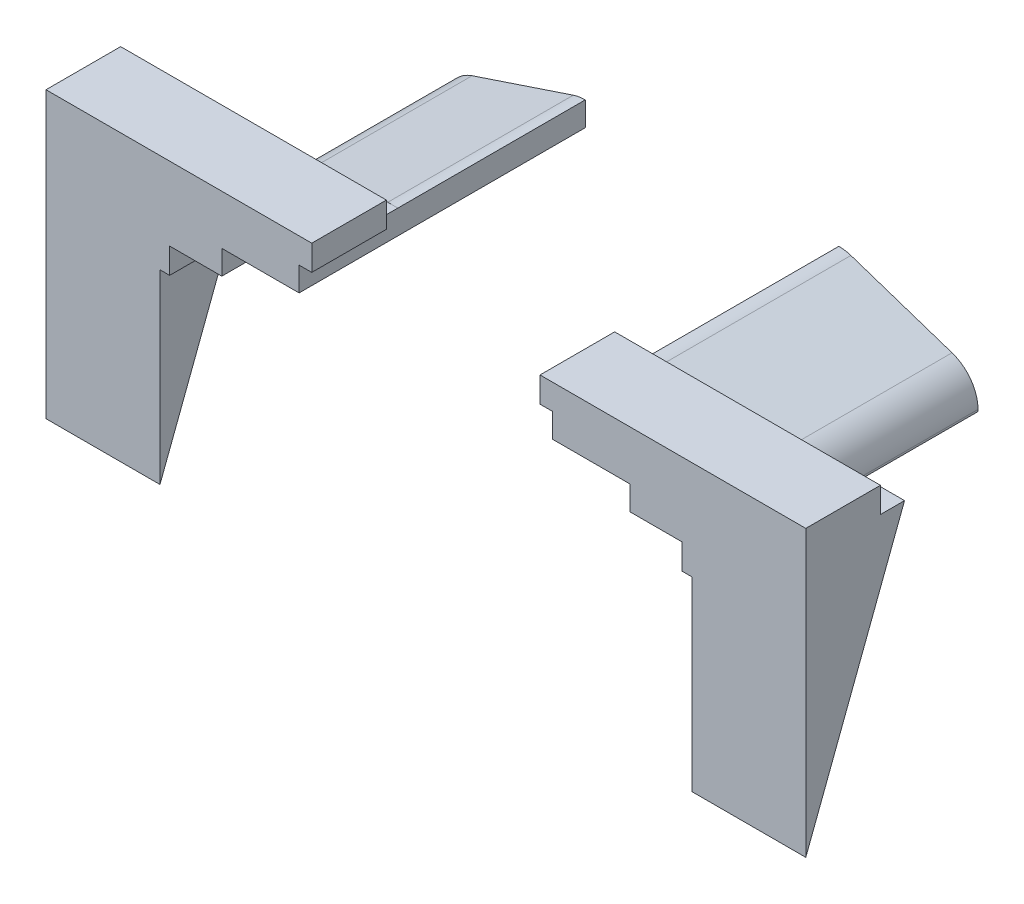
ISO-10303-21;
HEADER;
FILE_DESCRIPTION(('STEP AP214'),'2;1');
FILE_NAME('part.step','',(''),(''),'','','');
FILE_SCHEMA(('AUTOMOTIVE_DESIGN { 1 0 10303 214 1 1 1 1 }'));
ENDSEC;
DATA;
#1=APPLICATION_CONTEXT('core data for automotive mechanical design processes');
#2=APPLICATION_PROTOCOL_DEFINITION('international standard','automotive_design',2000,#1);
#3=PRODUCT_CONTEXT('',#1,'mechanical');
#4=PRODUCT('Part','Part','',(#3));
#5=PRODUCT_RELATED_PRODUCT_CATEGORY('part','',(#4));
#6=PRODUCT_DEFINITION_FORMATION('','',#4);
#7=PRODUCT_DEFINITION_CONTEXT('part definition',#1,'design');
#8=PRODUCT_DEFINITION('design','',#6,#7);
#9=PRODUCT_DEFINITION_SHAPE('','',#8);
#10=(LENGTH_UNIT() NAMED_UNIT(*) SI_UNIT(.MILLI.,.METRE.));
#11=(NAMED_UNIT(*) PLANE_ANGLE_UNIT() SI_UNIT($,.RADIAN.));
#12=(NAMED_UNIT(*) SI_UNIT($,.STERADIAN.) SOLID_ANGLE_UNIT());
#13=UNCERTAINTY_MEASURE_WITH_UNIT(LENGTH_MEASURE(1.E-05),#10,'distance_accuracy_value','');
#14=(GEOMETRIC_REPRESENTATION_CONTEXT(3) GLOBAL_UNCERTAINTY_ASSIGNED_CONTEXT((#13)) GLOBAL_UNIT_ASSIGNED_CONTEXT((#10,
#11,#12)) REPRESENTATION_CONTEXT('',''));
#15=CARTESIAN_POINT('',(0.,0.,0.));
#16=DIRECTION('',(0.,0.,1.));
#17=DIRECTION('',(1.,0.,0.));
#18=AXIS2_PLACEMENT_3D('',#15,#16,#17);
#19=CARTESIAN_POINT('',(-300.,5.0000000000001,167.05));
#20=DIRECTION('',(0.,1.,0.));
#21=DIRECTION('',(0.,0.,1.));
#22=AXIS2_PLACEMENT_3D('',#19,#20,#21);
#23=PLANE('',#22);
#24=DIRECTION('',(0.,0.,1.));
#25=VECTOR('',#24,1.);
#26=CARTESIAN_POINT('',(-100.131670194949,4.99999999999998,-345.933108931715));
#27=LINE('',#26,#25);
#28=CARTESIAN_POINT('',(-100.131670194949,5.00000000000007,148.));
#29=VERTEX_POINT('',#28);
#30=CARTESIAN_POINT('',(-100.131670194949,4.99999999999998,167.05));
#31=VERTEX_POINT('',#30);
#32=EDGE_CURVE('E194',#29,#31,#27,.T.);
#33=ORIENTED_EDGE('',*,*,#32,.F.);
#34=DIRECTION('',(1.,0.,0.));
#35=VECTOR('',#34,1.);
#36=CARTESIAN_POINT('',(-300.,5.0000000000001,148.));
#37=LINE('',#36,#35);
#38=CARTESIAN_POINT('',(-300.,5.0000000000001,148.));
#39=VERTEX_POINT('',#38);
#40=EDGE_CURVE('E219',#39,#29,#37,.T.);
#41=ORIENTED_EDGE('',*,*,#40,.F.);
#42=DIRECTION('',(0.,0.,-1.));
#43=VECTOR('',#42,1.);
#44=CARTESIAN_POINT('',(-300.,5.0000000000001,167.05));
#45=LINE('',#44,#43);
#46=CARTESIAN_POINT('',(-300.,5.0000000000001,167.05));
#47=VERTEX_POINT('',#46);
#48=EDGE_CURVE('E195',#47,#39,#45,.T.);
#49=ORIENTED_EDGE('',*,*,#48,.F.);
#50=DIRECTION('',(-1.,0.,0.));
#51=VECTOR('',#50,1.);
#52=CARTESIAN_POINT('',(-300.,5.0000000000001,167.05));
#53=LINE('',#52,#51);
#54=EDGE_CURVE('E204',#31,#47,#53,.T.);
#55=ORIENTED_EDGE('',*,*,#54,.F.);
#56=EDGE_LOOP('',(#33,#41,#49,#55));
#57=FACE_BOUND('',#56,.T.);
#58=ADVANCED_FACE('F46',(#57),#23,.T.);
#59=CARTESIAN_POINT('',(0.,0.,167.05));
#60=DIRECTION('',(0.,0.,1.));
#61=DIRECTION('',(-1.,0.,0.));
#62=AXIS2_PLACEMENT_3D('',#59,#60,#61);
#63=PLANE('',#62);
#64=DIRECTION('',(-1.,0.,0.));
#65=VECTOR('',#64,1.);
#66=CARTESIAN_POINT('',(0.,25.0000000000001,167.05));
#67=LINE('',#66,#65);
#68=CARTESIAN_POINT('',(-90.1316701949486,25.0000000000001,167.05));
#69=VERTEX_POINT('',#68);
#70=CARTESIAN_POINT('',(-300.,25.0000000000001,167.05));
#71=VERTEX_POINT('',#70);
#72=EDGE_CURVE('E198',#69,#71,#67,.T.);
#73=ORIENTED_EDGE('',*,*,#72,.F.);
#74=DIRECTION('',(0.,-1.,0.));
#75=VECTOR('',#74,1.);
#76=CARTESIAN_POINT('',(-90.1316701949486,0.,167.05));
#77=LINE('',#76,#75);
#78=CARTESIAN_POINT('',(-90.1316701949486,4.99999999999998,167.05));
#79=VERTEX_POINT('',#78);
#80=EDGE_CURVE('E173',#69,#79,#77,.T.);
#81=ORIENTED_EDGE('',*,*,#80,.T.);
#82=EDGE_CURVE('E201',#79,#31,#53,.T.);
#83=ORIENTED_EDGE('',*,*,#82,.T.);
#84=ORIENTED_EDGE('',*,*,#54,.T.);
#85=DIRECTION('',(0.,1.,0.));
#86=VECTOR('',#85,1.);
#87=CARTESIAN_POINT('',(-300.,5.0000000000001,167.05));
#88=LINE('',#87,#86);
#89=EDGE_CURVE('E199',#47,#71,#88,.T.);
#90=ORIENTED_EDGE('',*,*,#89,.T.);
#91=EDGE_LOOP('',(#73,#81,#83,#84,#90));
#92=FACE_BOUND('',#91,.T.);
#93=ADVANCED_FACE('F307',(#92),#63,.F.);
#94=CARTESIAN_POINT('',(-300.,-200.,226.));
#95=DIRECTION('',(0.,-0.35561611887515,-0.934632107300073));
#96=DIRECTION('',(0.,0.934632107300073,-0.35561611887515));
#97=AXIS2_PLACEMENT_3D('',#94,#95,#96);
#98=PLANE('',#97);
#99=DIRECTION('',(0.94188988136698,0.313963293788993,-0.119459204466056));
#100=VECTOR('',#99,1.);
#101=CARTESIAN_POINT('',(-88.3474224434364,10.5508591855212,145.887965773314));
#102=LINE('',#101,#100);
#103=CARTESIAN_POINT('',(-189.486832980505,-23.1622776601684,158.715403207284));
#104=VERTEX_POINT('',#103);
#105=CARTESIAN_POINT('',(-109.618503175454,3.4604989415154,148.58576137835));
#106=VERTEX_POINT('',#105);
#107=EDGE_CURVE('E242',#104,#106,#102,.T.);
#108=ORIENTED_EDGE('',*,*,#107,.F.);
#109=CARTESIAN_POINT('',(-180.,-51.6227766016838,169.544275975275));
#110=DIRECTION('',(0.,0.35561611887515,0.934632107300073));
#111=DIRECTION('',(0.,-0.934632107300073,0.35561611887515));
#112=AXIS2_PLACEMENT_3D('',#109,#110,#111);
#113=ELLIPSE('',#112,32.0981911125039,30.);
#114=CARTESIAN_POINT('',(-210.,-51.6227766016838,169.544275975275));
#115=VERTEX_POINT('',#114);
#116=EDGE_CURVE('E228',#104,#115,#113,.T.);
#117=ORIENTED_EDGE('',*,*,#116,.T.);
#118=DIRECTION('',(0.,-0.934632107300073,0.35561611887515));
#119=VECTOR('',#118,1.);
#120=CARTESIAN_POINT('',(-210.,49.823110020994,130.945353260305));
#121=LINE('',#120,#119);
#122=CARTESIAN_POINT('',(-210.,-53.131468061771,170.118314677162));
#123=VERTEX_POINT('',#122);
#124=EDGE_CURVE('E215',#115,#123,#121,.T.);
#125=ORIENTED_EDGE('',*,*,#124,.T.);
#126=CARTESIAN_POINT('',(-210.,-200.,226.));
#127=VERTEX_POINT('',#126);
#128=EDGE_CURVE('E187',#123,#127,#121,.T.);
#129=ORIENTED_EDGE('',*,*,#128,.T.);
#130=DIRECTION('',(1.,0.,0.));
#131=VECTOR('',#130,1.);
#132=CARTESIAN_POINT('',(-300.,-200.,226.));
#133=LINE('',#132,#131);
#134=CARTESIAN_POINT('',(-300.,-200.,226.));
#135=VERTEX_POINT('',#134);
#136=EDGE_CURVE('E248',#135,#127,#133,.T.);
#137=ORIENTED_EDGE('',*,*,#136,.F.);
#138=DIRECTION('',(0.,-0.934632107300073,0.35561611887515));
#139=VECTOR('',#138,1.);
#140=CARTESIAN_POINT('',(-300.,-200.,226.));
#141=LINE('',#140,#139);
#142=EDGE_CURVE('E50',#39,#135,#141,.T.);
#143=ORIENTED_EDGE('',*,*,#142,.F.);
#144=ORIENTED_EDGE('',*,*,#40,.T.);
#145=CARTESIAN_POINT('',(-100.131670194949,-25.,159.414634146341));
#146=DIRECTION('',(0.,0.35561611887515,0.934632107300073));
#147=DIRECTION('',(0.,0.934632107300073,-0.35561611887515));
#148=AXIS2_PLACEMENT_3D('',#145,#146,#147);
#149=ELLIPSE('',#148,32.0981911125039,30.);
#150=EDGE_CURVE('E223',#29,#106,#149,.T.);
#151=ORIENTED_EDGE('',*,*,#150,.T.);
#152=EDGE_LOOP('',(#108,#117,#125,#129,#137,#143,#144,#151));
#153=FACE_BOUND('',#152,.T.);
#154=ADVANCED_FACE('F266',(#153),#98,.T.);
#155=CARTESIAN_POINT('',(-105.,4.99999999999998,0.));
#156=DIRECTION('',(-0.316227766016838,0.948683298050514,0.));
#157=DIRECTION('',(0.948683298050514,0.316227766016838,0.));
#158=AXIS2_PLACEMENT_3D('',#155,#156,#157);
#159=PLANE('',#158);
#160=DIRECTION('',(0.948683298050514,0.316227766016838,0.));
#161=VECTOR('',#160,1.);
#162=CARTESIAN_POINT('',(-105.,4.99999999999998,0.));
#163=LINE('',#162,#161);
#164=CARTESIAN_POINT('',(-189.486832980505,-23.1622776601684,0.));
#165=VERTEX_POINT('',#164);
#166=CARTESIAN_POINT('',(-109.618503175454,3.46049894151539,0.));
#167=VERTEX_POINT('',#166);
#168=EDGE_CURVE('E218',#165,#167,#163,.T.);
#169=ORIENTED_EDGE('',*,*,#168,.F.);
#170=DIRECTION('',(0.,0.,1.));
#171=VECTOR('',#170,1.);
#172=CARTESIAN_POINT('',(-189.486832980505,-23.1622776601684,0.));
#173=LINE('',#172,#171);
#174=EDGE_CURVE('E236',#165,#104,#173,.T.);
#175=ORIENTED_EDGE('',*,*,#174,.T.);
#176=ORIENTED_EDGE('',*,*,#107,.T.);
#177=DIRECTION('',(0.,0.,1.));
#178=VECTOR('',#177,1.);
#179=CARTESIAN_POINT('',(-109.618503175454,3.46049894151539,0.));
#180=LINE('',#179,#178);
#181=EDGE_CURVE('E239',#106,#167,#180,.F.);
#182=ORIENTED_EDGE('',*,*,#181,.T.);
#183=EDGE_LOOP('',(#169,#175,#176,#182));
#184=FACE_BOUND('',#183,.T.);
#185=ADVANCED_FACE('F336',(#184),#159,.T.);
#186=CARTESIAN_POINT('',(-180.,-51.6227766016838,0.));
#187=DIRECTION('',(0.,0.,1.));
#188=DIRECTION('',(-1.,0.,0.));
#189=AXIS2_PLACEMENT_3D('',#186,#187,#188);
#190=CYLINDRICAL_SURFACE('',#189,30.);
#191=CARTESIAN_POINT('',(-180.,-51.6227766016838,0.));
#192=DIRECTION('',(0.,0.,-1.));
#193=DIRECTION('',(-1.,0.,0.));
#194=AXIS2_PLACEMENT_3D('',#191,#192,#193);
#195=CIRCLE('',#194,30.);
#196=CARTESIAN_POINT('',(-210.,-51.6227766016838,0.));
#197=VERTEX_POINT('',#196);
#198=EDGE_CURVE('E226',#197,#165,#195,.T.);
#199=ORIENTED_EDGE('',*,*,#198,.F.);
#200=DIRECTION('',(0.,0.,1.));
#201=VECTOR('',#200,1.);
#202=CARTESIAN_POINT('',(-210.,-51.6227766016838,0.));
#203=LINE('',#202,#201);
#204=EDGE_CURVE('E234',#115,#197,#203,.F.);
#205=ORIENTED_EDGE('',*,*,#204,.F.);
#206=ORIENTED_EDGE('',*,*,#116,.F.);
#207=ORIENTED_EDGE('',*,*,#174,.F.);
#208=EDGE_LOOP('',(#199,#205,#206,#207));
#209=FACE_BOUND('',#208,.T.);
#210=ADVANCED_FACE('F357',(#209),#190,.T.);
#211=CARTESIAN_POINT('',(-210.,0.,0.));
#212=DIRECTION('',(1.,0.,0.));
#213=DIRECTION('',(0.,-1.,0.));
#214=AXIS2_PLACEMENT_3D('',#211,#212,#213);
#215=PLANE('',#214);
#216=DIRECTION('',(0.,-1.,0.));
#217=VECTOR('',#216,1.);
#218=CARTESIAN_POINT('',(-210.,0.,0.));
#219=LINE('',#218,#217);
#220=CARTESIAN_POINT('',(-210.,-53.1314680617709,0.));
#221=VERTEX_POINT('',#220);
#222=EDGE_CURVE('E84',#197,#221,#219,.T.);
#223=ORIENTED_EDGE('',*,*,#222,.T.);
#224=DIRECTION('',(0.,0.,1.));
#225=VECTOR('',#224,1.);
#226=CARTESIAN_POINT('',(-210.,-53.1314680617709,-345.933108931715));
#227=LINE('',#226,#225);
#228=EDGE_CURVE('E188',#221,#123,#227,.T.);
#229=ORIENTED_EDGE('',*,*,#228,.T.);
#230=ORIENTED_EDGE('',*,*,#124,.F.);
#231=ORIENTED_EDGE('',*,*,#204,.T.);
#232=EDGE_LOOP('',(#223,#229,#230,#231));
#233=FACE_BOUND('',#232,.T.);
#234=ADVANCED_FACE('F48',(#233),#215,.F.);
#235=CARTESIAN_POINT('',(-100.131670194949,-25.,0.));
#236=DIRECTION('',(0.,0.,-1.));
#237=DIRECTION('',(1.,0.,0.));
#238=AXIS2_PLACEMENT_3D('',#235,#236,#237);
#239=CYLINDRICAL_SURFACE('',#238,30.);
#240=CARTESIAN_POINT('',(-100.131670194949,-25.,0.));
#241=DIRECTION('',(0.,0.,-1.));
#242=DIRECTION('',(-1.,0.,0.));
#243=AXIS2_PLACEMENT_3D('',#240,#241,#242);
#244=CIRCLE('',#243,30.);
#245=CARTESIAN_POINT('',(-100.131670194949,4.99999999999998,0.));
#246=VERTEX_POINT('',#245);
#247=EDGE_CURVE('E220',#167,#246,#244,.T.);
#248=ORIENTED_EDGE('',*,*,#247,.F.);
#249=ORIENTED_EDGE('',*,*,#181,.F.);
#250=ORIENTED_EDGE('',*,*,#150,.F.);
#251=DIRECTION('',(0.,0.,1.));
#252=VECTOR('',#251,1.);
#253=CARTESIAN_POINT('',(-100.131670194949,4.99999999999998,148.));
#254=LINE('',#253,#252);
#255=EDGE_CURVE('E231',#246,#29,#254,.T.);
#256=ORIENTED_EDGE('',*,*,#255,.F.);
#257=EDGE_LOOP('',(#248,#249,#250,#256));
#258=FACE_BOUND('',#257,.T.);
#259=ADVANCED_FACE('F330',(#258),#239,.T.);
#260=CARTESIAN_POINT('',(0.,4.99999999999998,-345.933108931715));
#261=DIRECTION('',(0.,1.,0.));
#262=DIRECTION('',(0.,0.,-1.));
#263=AXIS2_PLACEMENT_3D('',#260,#261,#262);
#264=PLANE('',#263);
#265=DIRECTION('',(0.,0.,1.));
#266=VECTOR('',#265,1.);
#267=CARTESIAN_POINT('',(-90.1316701949486,4.99999999999998,-345.933108931715));
#268=LINE('',#267,#266);
#269=CARTESIAN_POINT('',(-90.1316701949486,4.99999999999998,226.));
#270=VERTEX_POINT('',#269);
#271=EDGE_CURVE('E192',#79,#270,#268,.T.);
#272=ORIENTED_EDGE('',*,*,#271,.T.);
#273=DIRECTION('',(1.,0.,0.));
#274=VECTOR('',#273,1.);
#275=CARTESIAN_POINT('',(0.,4.99999999999998,226.));
#276=LINE('',#275,#274);
#277=CARTESIAN_POINT('',(-100.131670194949,4.99999999999998,226.));
#278=VERTEX_POINT('',#277);
#279=EDGE_CURVE('E285',#278,#270,#276,.T.);
#280=ORIENTED_EDGE('',*,*,#279,.F.);
#281=EDGE_CURVE('E189',#31,#278,#27,.T.);
#282=ORIENTED_EDGE('',*,*,#281,.F.);
#283=ORIENTED_EDGE('',*,*,#82,.F.);
#284=EDGE_LOOP('',(#272,#280,#282,#283));
#285=FACE_BOUND('',#284,.T.);
#286=ADVANCED_FACE('F299',(#285),#264,.F.);
#287=CARTESIAN_POINT('',(-90.1316701949486,0.,-345.933108931715));
#288=DIRECTION('',(-1.,0.,0.));
#289=DIRECTION('',(0.,0.,-1.));
#290=AXIS2_PLACEMENT_3D('',#287,#288,#289);
#291=PLANE('',#290);
#292=DIRECTION('',(0.,0.,1.));
#293=VECTOR('',#292,1.);
#294=CARTESIAN_POINT('',(-90.1316701949486,25.0000000000001,-345.933108931715));
#295=LINE('',#294,#293);
#296=CARTESIAN_POINT('',(-90.1316701949486,25.0000000000001,226.));
#297=VERTEX_POINT('',#296);
#298=EDGE_CURVE('E210',#69,#297,#295,.T.);
#299=ORIENTED_EDGE('',*,*,#298,.T.);
#300=DIRECTION('',(0.,1.,0.));
#301=VECTOR('',#300,1.);
#302=CARTESIAN_POINT('',(-90.1316701949486,0.,226.));
#303=LINE('',#302,#301);
#304=EDGE_CURVE('E282',#270,#297,#303,.T.);
#305=ORIENTED_EDGE('',*,*,#304,.F.);
#306=ORIENTED_EDGE('',*,*,#271,.F.);
#307=ORIENTED_EDGE('',*,*,#80,.F.);
#308=EDGE_LOOP('',(#299,#305,#306,#307));
#309=FACE_BOUND('',#308,.T.);
#310=ADVANCED_FACE('F302',(#309),#291,.F.);
#311=CARTESIAN_POINT('',(-100.131670194949,0.,-345.933108931715));
#312=DIRECTION('',(-1.,0.,0.));
#313=DIRECTION('',(0.,0.,-1.));
#314=AXIS2_PLACEMENT_3D('',#311,#312,#313);
#315=PLANE('',#314);
#316=ORIENTED_EDGE('',*,*,#255,.T.);
#317=ORIENTED_EDGE('',*,*,#32,.T.);
#318=ORIENTED_EDGE('',*,*,#281,.T.);
#319=DIRECTION('',(0.,1.,0.));
#320=VECTOR('',#319,1.);
#321=CARTESIAN_POINT('',(-100.131670194949,0.,226.));
#322=LINE('',#321,#320);
#323=CARTESIAN_POINT('',(-100.131670194949,-14.05,226.));
#324=VERTEX_POINT('',#323);
#325=EDGE_CURVE('E165',#324,#278,#322,.T.);
#326=ORIENTED_EDGE('',*,*,#325,.F.);
#327=DIRECTION('',(0.,0.,1.));
#328=VECTOR('',#327,1.);
#329=CARTESIAN_POINT('',(-100.131670194949,-14.05,-345.933108931715));
#330=LINE('',#329,#328);
#331=CARTESIAN_POINT('',(-100.131670194949,-14.05,0.));
#332=VERTEX_POINT('',#331);
#333=EDGE_CURVE('E193',#332,#324,#330,.T.);
#334=ORIENTED_EDGE('',*,*,#333,.F.);
#335=DIRECTION('',(0.,-1.,0.));
#336=VECTOR('',#335,1.);
#337=CARTESIAN_POINT('',(-100.131670194949,0.,0.));
#338=LINE('',#337,#336);
#339=EDGE_CURVE('E182',#246,#332,#338,.T.);
#340=ORIENTED_EDGE('',*,*,#339,.F.);
#341=EDGE_LOOP('',(#316,#317,#318,#326,#334,#340));
#342=FACE_BOUND('',#341,.T.);
#343=ADVANCED_FACE('F294',(#342),#315,.F.);
#344=CARTESIAN_POINT('',(0.,-14.05,-345.933108931715));
#345=DIRECTION('',(0.,1.,0.));
#346=DIRECTION('',(-1.,0.,0.));
#347=AXIS2_PLACEMENT_3D('',#344,#345,#346);
#348=PLANE('',#347);
#349=ORIENTED_EDGE('',*,*,#333,.T.);
#350=DIRECTION('',(1.,0.,0.));
#351=VECTOR('',#350,1.);
#352=CARTESIAN_POINT('',(0.,-14.05,226.));
#353=LINE('',#352,#351);
#354=CARTESIAN_POINT('',(-161.15,-14.05,226.));
#355=VERTEX_POINT('',#354);
#356=EDGE_CURVE('E163',#355,#324,#353,.T.);
#357=ORIENTED_EDGE('',*,*,#356,.F.);
#358=DIRECTION('',(0.,0.,1.));
#359=VECTOR('',#358,1.);
#360=CARTESIAN_POINT('',(-161.15,-14.05,-345.933108931715));
#361=LINE('',#360,#359);
#362=CARTESIAN_POINT('',(-161.15,-14.05,0.));
#363=VERTEX_POINT('',#362);
#364=EDGE_CURVE('E157',#363,#355,#361,.T.);
#365=ORIENTED_EDGE('',*,*,#364,.F.);
#366=DIRECTION('',(-1.,0.,0.));
#367=VECTOR('',#366,1.);
#368=CARTESIAN_POINT('',(0.,-14.05,0.));
#369=LINE('',#368,#367);
#370=EDGE_CURVE('E179',#332,#363,#369,.T.);
#371=ORIENTED_EDGE('',*,*,#370,.F.);
#372=EDGE_LOOP('',(#349,#357,#365,#371));
#373=FACE_BOUND('',#372,.T.);
#374=ADVANCED_FACE('F373',(#373),#348,.F.);
#375=CARTESIAN_POINT('',(-161.15,0.,-345.933108931715));
#376=DIRECTION('',(-1.,0.,0.));
#377=DIRECTION('',(0.,0.,-1.));
#378=AXIS2_PLACEMENT_3D('',#375,#376,#377);
#379=PLANE('',#378);
#380=ORIENTED_EDGE('',*,*,#364,.T.);
#381=DIRECTION('',(0.,1.,0.));
#382=VECTOR('',#381,1.);
#383=CARTESIAN_POINT('',(-161.15,0.,226.));
#384=LINE('',#383,#382);
#385=CARTESIAN_POINT('',(-161.15,-33.1,226.));
#386=VERTEX_POINT('',#385);
#387=EDGE_CURVE('E143',#386,#355,#384,.T.);
#388=ORIENTED_EDGE('',*,*,#387,.F.);
#389=DIRECTION('',(0.,0.,1.));
#390=VECTOR('',#389,1.);
#391=CARTESIAN_POINT('',(-161.15,-33.1,-345.933108931715));
#392=LINE('',#391,#390);
#393=CARTESIAN_POINT('',(-161.15,-33.1,0.));
#394=VERTEX_POINT('',#393);
#395=EDGE_CURVE('E151',#394,#386,#392,.T.);
#396=ORIENTED_EDGE('',*,*,#395,.F.);
#397=DIRECTION('',(0.,-1.,0.));
#398=VECTOR('',#397,1.);
#399=CARTESIAN_POINT('',(-161.15,0.,0.));
#400=LINE('',#399,#398);
#401=EDGE_CURVE('E177',#363,#394,#400,.T.);
#402=ORIENTED_EDGE('',*,*,#401,.F.);
#403=EDGE_LOOP('',(#380,#388,#396,#402));
#404=FACE_BOUND('',#403,.T.);
#405=ADVANCED_FACE('F160',(#404),#379,.F.);
#406=CARTESIAN_POINT('',(0.,-33.1,-345.933108931715));
#407=DIRECTION('',(0.,-1.,0.));
#408=DIRECTION('',(0.,0.,1.));
#409=AXIS2_PLACEMENT_3D('',#406,#407,#408);
#410=PLANE('',#409);
#411=DIRECTION('',(1.,0.,0.));
#412=VECTOR('',#411,1.);
#413=CARTESIAN_POINT('',(0.,-33.1,0.));
#414=LINE('',#413,#412);
#415=CARTESIAN_POINT('',(-202.337265555267,-33.1,0.));
#416=VERTEX_POINT('',#415);
#417=EDGE_CURVE('E154',#416,#394,#414,.T.);
#418=ORIENTED_EDGE('',*,*,#417,.T.);
#419=ORIENTED_EDGE('',*,*,#395,.T.);
#420=DIRECTION('',(-1.,0.,0.));
#421=VECTOR('',#420,1.);
#422=CARTESIAN_POINT('',(0.,-33.1,226.));
#423=LINE('',#422,#421);
#424=CARTESIAN_POINT('',(-202.337265555267,-33.1,226.));
#425=VERTEX_POINT('',#424);
#426=EDGE_CURVE('E138',#386,#425,#423,.T.);
#427=ORIENTED_EDGE('',*,*,#426,.T.);
#428=DIRECTION('',(0.,0.,1.));
#429=VECTOR('',#428,1.);
#430=CARTESIAN_POINT('',(-202.337265555267,-33.1,-345.933108931715));
#431=LINE('',#430,#429);
#432=EDGE_CURVE('E158',#416,#425,#431,.T.);
#433=ORIENTED_EDGE('',*,*,#432,.F.);
#434=EDGE_LOOP('',(#418,#419,#427,#433));
#435=FACE_BOUND('',#434,.T.);
#436=ADVANCED_FACE('F152',(#435),#410,.T.);
#437=CARTESIAN_POINT('',(0.,0.,0.));
#438=DIRECTION('',(0.,0.,1.));
#439=DIRECTION('',(-1.,0.,0.));
#440=AXIS2_PLACEMENT_3D('',#437,#438,#439);
#441=PLANE('',#440);
#442=ORIENTED_EDGE('',*,*,#247,.T.);
#443=ORIENTED_EDGE('',*,*,#339,.T.);
#444=ORIENTED_EDGE('',*,*,#370,.T.);
#445=ORIENTED_EDGE('',*,*,#401,.T.);
#446=ORIENTED_EDGE('',*,*,#417,.F.);
#447=DIRECTION('',(0.,-1.,0.));
#448=VECTOR('',#447,1.);
#449=CARTESIAN_POINT('',(-202.337265555267,0.,0.));
#450=LINE('',#449,#448);
#451=CARTESIAN_POINT('',(-202.337265555267,-53.1314680617709,0.));
#452=VERTEX_POINT('',#451);
#453=EDGE_CURVE('E172',#416,#452,#450,.T.);
#454=ORIENTED_EDGE('',*,*,#453,.T.);
#455=DIRECTION('',(-1.,0.,0.));
#456=VECTOR('',#455,1.);
#457=CARTESIAN_POINT('',(0.,-53.1314680617706,0.));
#458=LINE('',#457,#456);
#459=EDGE_CURVE('E170',#452,#221,#458,.T.);
#460=ORIENTED_EDGE('',*,*,#459,.T.);
#461=ORIENTED_EDGE('',*,*,#222,.F.);
#462=ORIENTED_EDGE('',*,*,#198,.T.);
#463=ORIENTED_EDGE('',*,*,#168,.T.);
#464=EDGE_LOOP('',(#442,#443,#444,#445,#446,#454,#460,#461,#462,#463));
#465=FACE_BOUND('',#464,.T.);
#466=ADVANCED_FACE('F331',(#465),#441,.F.);
#467=CARTESIAN_POINT('',(-202.337265555267,0.,-345.933108931715));
#468=DIRECTION('',(-1.,0.,0.));
#469=DIRECTION('',(0.,0.,-1.));
#470=AXIS2_PLACEMENT_3D('',#467,#468,#469);
#471=PLANE('',#470);
#472=ORIENTED_EDGE('',*,*,#432,.T.);
#473=DIRECTION('',(0.,1.,0.));
#474=VECTOR('',#473,1.);
#475=CARTESIAN_POINT('',(-202.337265555267,0.,226.));
#476=LINE('',#475,#474);
#477=CARTESIAN_POINT('',(-202.337265555267,-53.1314680617709,226.));
#478=VERTEX_POINT('',#477);
#479=EDGE_CURVE('E56',#478,#425,#476,.T.);
#480=ORIENTED_EDGE('',*,*,#479,.F.);
#481=DIRECTION('',(0.,0.,1.));
#482=VECTOR('',#481,1.);
#483=CARTESIAN_POINT('',(-202.337265555267,-53.1314680617709,-345.933108931715));
#484=LINE('',#483,#482);
#485=EDGE_CURVE('E185',#452,#478,#484,.T.);
#486=ORIENTED_EDGE('',*,*,#485,.F.);
#487=ORIENTED_EDGE('',*,*,#453,.F.);
#488=EDGE_LOOP('',(#472,#480,#486,#487));
#489=FACE_BOUND('',#488,.T.);
#490=ADVANCED_FACE('F365',(#489),#471,.F.);
#491=CARTESIAN_POINT('',(0.,0.,226.));
#492=DIRECTION('',(0.,0.,-1.));
#493=DIRECTION('',(1.,0.,0.));
#494=AXIS2_PLACEMENT_3D('',#491,#492,#493);
#495=PLANE('',#494);
#496=ORIENTED_EDGE('',*,*,#136,.T.);
#497=DIRECTION('',(0.,1.,0.));
#498=VECTOR('',#497,1.);
#499=CARTESIAN_POINT('',(-210.,0.,226.));
#500=LINE('',#499,#498);
#501=CARTESIAN_POINT('',(-210.,-53.1314680617709,226.));
#502=VERTEX_POINT('',#501);
#503=EDGE_CURVE('E274',#127,#502,#500,.T.);
#504=ORIENTED_EDGE('',*,*,#503,.T.);
#505=DIRECTION('',(1.,0.,0.));
#506=VECTOR('',#505,1.);
#507=CARTESIAN_POINT('',(0.,-53.1314680617706,226.));
#508=LINE('',#507,#506);
#509=EDGE_CURVE('E12',#502,#478,#508,.T.);
#510=ORIENTED_EDGE('',*,*,#509,.T.);
#511=ORIENTED_EDGE('',*,*,#479,.T.);
#512=ORIENTED_EDGE('',*,*,#426,.F.);
#513=ORIENTED_EDGE('',*,*,#387,.T.);
#514=ORIENTED_EDGE('',*,*,#356,.T.);
#515=ORIENTED_EDGE('',*,*,#325,.T.);
#516=ORIENTED_EDGE('',*,*,#279,.T.);
#517=ORIENTED_EDGE('',*,*,#304,.T.);
#518=DIRECTION('',(1.,0.,0.));
#519=VECTOR('',#518,1.);
#520=CARTESIAN_POINT('',(0.,25.0000000000001,226.));
#521=LINE('',#520,#519);
#522=CARTESIAN_POINT('',(-300.,25.0000000000001,226.));
#523=VERTEX_POINT('',#522);
#524=EDGE_CURVE('E276',#523,#297,#521,.T.);
#525=ORIENTED_EDGE('',*,*,#524,.F.);
#526=DIRECTION('',(0.,1.,0.));
#527=VECTOR('',#526,1.);
#528=CARTESIAN_POINT('',(-300.,0.,226.));
#529=LINE('',#528,#527);
#530=EDGE_CURVE('E257',#135,#523,#529,.T.);
#531=ORIENTED_EDGE('',*,*,#530,.F.);
#532=EDGE_LOOP('',(#496,#504,#510,#511,#512,#513,#514,#515,#516,#517,#525,#531));
#533=FACE_BOUND('',#532,.T.);
#534=ADVANCED_FACE('F141',(#533),#495,.F.);
#535=CARTESIAN_POINT('',(0.,-53.1314680617706,-345.933108931715));
#536=DIRECTION('',(0.,1.,0.));
#537=DIRECTION('',(-1.,0.,0.));
#538=AXIS2_PLACEMENT_3D('',#535,#536,#537);
#539=PLANE('',#538);
#540=ORIENTED_EDGE('',*,*,#485,.T.);
#541=ORIENTED_EDGE('',*,*,#509,.F.);
#542=EDGE_CURVE('E77',#123,#502,#227,.T.);
#543=ORIENTED_EDGE('',*,*,#542,.F.);
#544=ORIENTED_EDGE('',*,*,#228,.F.);
#545=ORIENTED_EDGE('',*,*,#459,.F.);
#546=EDGE_LOOP('',(#540,#541,#543,#544,#545));
#547=FACE_BOUND('',#546,.T.);
#548=ADVANCED_FACE('F368',(#547),#539,.F.);
#549=CARTESIAN_POINT('',(-210.,0.,-345.933108931715));
#550=DIRECTION('',(-1.,0.,0.));
#551=DIRECTION('',(0.,-1.,0.));
#552=AXIS2_PLACEMENT_3D('',#549,#550,#551);
#553=PLANE('',#552);
#554=ORIENTED_EDGE('',*,*,#542,.T.);
#555=ORIENTED_EDGE('',*,*,#503,.F.);
#556=ORIENTED_EDGE('',*,*,#128,.F.);
#557=EDGE_LOOP('',(#554,#555,#556));
#558=FACE_BOUND('',#557,.T.);
#559=ADVANCED_FACE('F273',(#558),#553,.F.);
#560=CARTESIAN_POINT('',(0.,25.0000000000001,-345.933108931715));
#561=DIRECTION('',(0.,1.,0.));
#562=DIRECTION('',(0.,0.,-1.));
#563=AXIS2_PLACEMENT_3D('',#560,#561,#562);
#564=PLANE('',#563);
#565=ORIENTED_EDGE('',*,*,#72,.T.);
#566=DIRECTION('',(0.,0.,1.));
#567=VECTOR('',#566,1.);
#568=CARTESIAN_POINT('',(-300.,25.0000000000001,-345.933108931715));
#569=LINE('',#568,#567);
#570=EDGE_CURVE('E93',#71,#523,#569,.T.);
#571=ORIENTED_EDGE('',*,*,#570,.T.);
#572=ORIENTED_EDGE('',*,*,#524,.T.);
#573=ORIENTED_EDGE('',*,*,#298,.F.);
#574=EDGE_LOOP('',(#565,#571,#572,#573));
#575=FACE_BOUND('',#574,.T.);
#576=ADVANCED_FACE('F305',(#575),#564,.T.);
#577=CARTESIAN_POINT('',(-300.,0.,-345.933108931715));
#578=DIRECTION('',(-1.,0.,0.));
#579=DIRECTION('',(0.,0.,-1.));
#580=AXIS2_PLACEMENT_3D('',#577,#578,#579);
#581=PLANE('',#580);
#582=ORIENTED_EDGE('',*,*,#142,.T.);
#583=ORIENTED_EDGE('',*,*,#530,.T.);
#584=ORIENTED_EDGE('',*,*,#570,.F.);
#585=ORIENTED_EDGE('',*,*,#89,.F.);
#586=ORIENTED_EDGE('',*,*,#48,.T.);
#587=EDGE_LOOP('',(#582,#583,#584,#585,#586));
#588=FACE_BOUND('',#587,.T.);
#589=ADVANCED_FACE('F256',(#588),#581,.T.);
#590=CLOSED_SHELL('',(#58,#93,#154,#185,#210,#234,#259,#286,#310,#343,#374,#405,#436,#466,#490,
#534,#548,#559,#576,#589));
#591=MANIFOLD_SOLID_BREP('B2',#590);
#592=CARTESIAN_POINT('',(300.,5.0000000000001,167.05));
#593=DIRECTION('',(0.,1.,0.));
#594=DIRECTION('',(0.,0.,1.));
#595=AXIS2_PLACEMENT_3D('',#592,#593,#594);
#596=PLANE('',#595);
#597=DIRECTION('',(0.,0.,1.));
#598=VECTOR('',#597,1.);
#599=CARTESIAN_POINT('',(100.131670194949,4.99999999999998,-345.933108931715));
#600=LINE('',#599,#598);
#601=CARTESIAN_POINT('',(100.131670194949,5.00000000000007,148.));
#602=VERTEX_POINT('',#601);
#603=CARTESIAN_POINT('',(100.131670194949,4.99999999999998,167.05));
#604=VERTEX_POINT('',#603);
#605=EDGE_CURVE('E675',#602,#604,#600,.T.);
#606=ORIENTED_EDGE('',*,*,#605,.T.);
#607=DIRECTION('',(1.,0.,0.));
#608=VECTOR('',#607,1.);
#609=CARTESIAN_POINT('',(300.,5.0000000000001,167.05));
#610=LINE('',#609,#608);
#611=CARTESIAN_POINT('',(300.,5.0000000000001,167.05));
#612=VERTEX_POINT('',#611);
#613=EDGE_CURVE('E684',#604,#612,#610,.T.);
#614=ORIENTED_EDGE('',*,*,#613,.T.);
#615=DIRECTION('',(0.,0.,-1.));
#616=VECTOR('',#615,1.);
#617=CARTESIAN_POINT('',(300.,5.0000000000001,167.05));
#618=LINE('',#617,#616);
#619=CARTESIAN_POINT('',(300.,5.0000000000001,148.));
#620=VERTEX_POINT('',#619);
#621=EDGE_CURVE('E676',#612,#620,#618,.T.);
#622=ORIENTED_EDGE('',*,*,#621,.T.);
#623=DIRECTION('',(-1.,0.,0.));
#624=VECTOR('',#623,1.);
#625=CARTESIAN_POINT('',(300.,5.0000000000001,148.));
#626=LINE('',#625,#624);
#627=EDGE_CURVE('E697',#620,#602,#626,.T.);
#628=ORIENTED_EDGE('',*,*,#627,.T.);
#629=EDGE_LOOP('',(#606,#614,#622,#628));
#630=FACE_BOUND('',#629,.T.);
#631=ADVANCED_FACE('F523',(#630),#596,.T.);
#632=CARTESIAN_POINT('',(0.,0.,167.05));
#633=DIRECTION('',(0.,0.,1.));
#634=DIRECTION('',(1.,0.,0.));
#635=AXIS2_PLACEMENT_3D('',#632,#633,#634);
#636=PLANE('',#635);
#637=DIRECTION('',(1.,0.,0.));
#638=VECTOR('',#637,1.);
#639=CARTESIAN_POINT('',(0.,25.0000000000001,167.05));
#640=LINE('',#639,#638);
#641=CARTESIAN_POINT('',(90.1316701949486,25.0000000000001,167.05));
#642=VERTEX_POINT('',#641);
#643=CARTESIAN_POINT('',(300.,25.0000000000001,167.05));
#644=VERTEX_POINT('',#643);
#645=EDGE_CURVE('E679',#642,#644,#640,.T.);
#646=ORIENTED_EDGE('',*,*,#645,.T.);
#647=DIRECTION('',(0.,1.,0.));
#648=VECTOR('',#647,1.);
#649=CARTESIAN_POINT('',(300.,5.0000000000001,167.05));
#650=LINE('',#649,#648);
#651=EDGE_CURVE('E575',#612,#644,#650,.T.);
#652=ORIENTED_EDGE('',*,*,#651,.F.);
#653=ORIENTED_EDGE('',*,*,#613,.F.);
#654=CARTESIAN_POINT('',(90.1316701949486,4.99999999999998,167.05));
#655=VERTEX_POINT('',#654);
#656=EDGE_CURVE('E681',#655,#604,#610,.T.);
#657=ORIENTED_EDGE('',*,*,#656,.F.);
#658=DIRECTION('',(0.,-1.,0.));
#659=VECTOR('',#658,1.);
#660=CARTESIAN_POINT('',(90.1316701949486,0.,167.05));
#661=LINE('',#660,#659);
#662=EDGE_CURVE('E657',#642,#655,#661,.T.);
#663=ORIENTED_EDGE('',*,*,#662,.F.);
#664=EDGE_LOOP('',(#646,#652,#653,#657,#663));
#665=FACE_BOUND('',#664,.T.);
#666=ADVANCED_FACE('F814',(#665),#636,.F.);
#667=CARTESIAN_POINT('',(300.,-200.,226.));
#668=DIRECTION('',(0.,-0.35561611887515,-0.934632107300073));
#669=DIRECTION('',(0.,0.934632107300073,-0.35561611887515));
#670=AXIS2_PLACEMENT_3D('',#667,#668,#669);
#671=PLANE('',#670);
#672=DIRECTION('',(-0.94188988136698,0.313963293788993,-0.119459204466056));
#673=VECTOR('',#672,1.);
#674=CARTESIAN_POINT('',(88.3474224434364,10.5508591855212,145.887965773314));
#675=LINE('',#674,#673);
#676=CARTESIAN_POINT('',(189.486832980505,-23.1622776601684,158.715403207284));
#677=VERTEX_POINT('',#676);
#678=CARTESIAN_POINT('',(109.618503175454,3.4604989415154,148.58576137835));
#679=VERTEX_POINT('',#678);
#680=EDGE_CURVE('E719',#677,#679,#675,.T.);
#681=ORIENTED_EDGE('',*,*,#680,.T.);
#682=CARTESIAN_POINT('',(100.131670194949,-25.,159.414634146341));
#683=DIRECTION('',(0.,-0.35561611887515,-0.934632107300073));
#684=DIRECTION('',(0.,0.934632107300073,-0.35561611887515));
#685=AXIS2_PLACEMENT_3D('',#682,#683,#684);
#686=ELLIPSE('',#685,32.0981911125039,30.);
#687=EDGE_CURVE('E701',#602,#679,#686,.T.);
#688=ORIENTED_EDGE('',*,*,#687,.F.);
#689=ORIENTED_EDGE('',*,*,#627,.F.);
#690=DIRECTION('',(0.,-0.934632107300073,0.35561611887515));
#691=VECTOR('',#690,1.);
#692=CARTESIAN_POINT('',(300.,-200.,226.));
#693=LINE('',#692,#691);
#694=CARTESIAN_POINT('',(300.,-200.,226.));
#695=VERTEX_POINT('',#694);
#696=EDGE_CURVE('E527',#620,#695,#693,.T.);
#697=ORIENTED_EDGE('',*,*,#696,.T.);
#698=DIRECTION('',(-1.,0.,0.));
#699=VECTOR('',#698,1.);
#700=CARTESIAN_POINT('',(300.,-200.,226.));
#701=LINE('',#700,#699);
#702=CARTESIAN_POINT('',(210.,-200.,226.));
#703=VERTEX_POINT('',#702);
#704=EDGE_CURVE('E725',#695,#703,#701,.T.);
#705=ORIENTED_EDGE('',*,*,#704,.T.);
#706=DIRECTION('',(0.,-0.934632107300073,0.35561611887515));
#707=VECTOR('',#706,1.);
#708=CARTESIAN_POINT('',(210.,49.823110020994,130.945353260305));
#709=LINE('',#708,#707);
#710=CARTESIAN_POINT('',(210.,-53.131468061771,170.118314677162));
#711=VERTEX_POINT('',#710);
#712=EDGE_CURVE('E558',#711,#703,#709,.T.);
#713=ORIENTED_EDGE('',*,*,#712,.F.);
#714=CARTESIAN_POINT('',(210.,-51.6227766016838,169.544275975275));
#715=VERTEX_POINT('',#714);
#716=EDGE_CURVE('E693',#715,#711,#709,.T.);
#717=ORIENTED_EDGE('',*,*,#716,.F.);
#718=CARTESIAN_POINT('',(180.,-51.6227766016838,169.544275975275));
#719=DIRECTION('',(0.,-0.35561611887515,-0.934632107300073));
#720=DIRECTION('',(0.,-0.934632107300073,0.35561611887515));
#721=AXIS2_PLACEMENT_3D('',#718,#719,#720);
#722=ELLIPSE('',#721,32.0981911125039,30.);
#723=EDGE_CURVE('E705',#677,#715,#722,.T.);
#724=ORIENTED_EDGE('',*,*,#723,.F.);
#725=EDGE_LOOP('',(#681,#688,#689,#697,#705,#713,#717,#724));
#726=FACE_BOUND('',#725,.T.);
#727=ADVANCED_FACE('F733',(#726),#671,.T.);
#728=CARTESIAN_POINT('',(105.,4.99999999999998,0.));
#729=DIRECTION('',(0.316227766016838,0.948683298050514,0.));
#730=DIRECTION('',(-0.948683298050514,0.316227766016838,0.));
#731=AXIS2_PLACEMENT_3D('',#728,#729,#730);
#732=PLANE('',#731);
#733=DIRECTION('',(-0.948683298050514,0.316227766016838,0.));
#734=VECTOR('',#733,1.);
#735=CARTESIAN_POINT('',(105.,4.99999999999998,0.));
#736=LINE('',#735,#734);
#737=CARTESIAN_POINT('',(189.486832980505,-23.1622776601684,0.));
#738=VERTEX_POINT('',#737);
#739=CARTESIAN_POINT('',(109.618503175454,3.46049894151539,0.));
#740=VERTEX_POINT('',#739);
#741=EDGE_CURVE('E696',#738,#740,#736,.T.);
#742=ORIENTED_EDGE('',*,*,#741,.T.);
#743=DIRECTION('',(0.,0.,1.));
#744=VECTOR('',#743,1.);
#745=CARTESIAN_POINT('',(109.618503175454,3.46049894151539,0.));
#746=LINE('',#745,#744);
#747=EDGE_CURVE('E716',#679,#740,#746,.F.);
#748=ORIENTED_EDGE('',*,*,#747,.F.);
#749=ORIENTED_EDGE('',*,*,#680,.F.);
#750=DIRECTION('',(0.,0.,1.));
#751=VECTOR('',#750,1.);
#752=CARTESIAN_POINT('',(189.486832980505,-23.1622776601684,0.));
#753=LINE('',#752,#751);
#754=EDGE_CURVE('E713',#738,#677,#753,.T.);
#755=ORIENTED_EDGE('',*,*,#754,.F.);
#756=EDGE_LOOP('',(#742,#748,#749,#755));
#757=FACE_BOUND('',#756,.T.);
#758=ADVANCED_FACE('F841',(#757),#732,.T.);
#759=CARTESIAN_POINT('',(180.,-51.6227766016838,0.));
#760=DIRECTION('',(0.,0.,1.));
#761=DIRECTION('',(1.,0.,0.));
#762=AXIS2_PLACEMENT_3D('',#759,#760,#761);
#763=CYLINDRICAL_SURFACE('',#762,30.);
#764=CARTESIAN_POINT('',(180.,-51.6227766016838,0.));
#765=DIRECTION('',(0.,0.,1.));
#766=DIRECTION('',(1.,0.,0.));
#767=AXIS2_PLACEMENT_3D('',#764,#765,#766);
#768=CIRCLE('',#767,30.);
#769=CARTESIAN_POINT('',(210.,-51.6227766016838,0.));
#770=VERTEX_POINT('',#769);
#771=EDGE_CURVE('E566',#770,#738,#768,.T.);
#772=ORIENTED_EDGE('',*,*,#771,.T.);
#773=ORIENTED_EDGE('',*,*,#754,.T.);
#774=ORIENTED_EDGE('',*,*,#723,.T.);
#775=DIRECTION('',(0.,0.,1.));
#776=VECTOR('',#775,1.);
#777=CARTESIAN_POINT('',(210.,-51.6227766016838,0.));
#778=LINE('',#777,#776);
#779=EDGE_CURVE('E711',#715,#770,#778,.F.);
#780=ORIENTED_EDGE('',*,*,#779,.T.);
#781=EDGE_LOOP('',(#772,#773,#774,#780));
#782=FACE_BOUND('',#781,.T.);
#783=ADVANCED_FACE('F846',(#782),#763,.T.);
#784=CARTESIAN_POINT('',(210.,0.,0.));
#785=DIRECTION('',(-1.,0.,0.));
#786=DIRECTION('',(0.,-1.,0.));
#787=AXIS2_PLACEMENT_3D('',#784,#785,#786);
#788=PLANE('',#787);
#789=DIRECTION('',(0.,-1.,0.));
#790=VECTOR('',#789,1.);
#791=CARTESIAN_POINT('',(210.,0.,0.));
#792=LINE('',#791,#790);
#793=CARTESIAN_POINT('',(210.,-53.1314680617709,0.));
#794=VERTEX_POINT('',#793);
#795=EDGE_CURVE('E668',#770,#794,#792,.T.);
#796=ORIENTED_EDGE('',*,*,#795,.F.);
#797=ORIENTED_EDGE('',*,*,#779,.F.);
#798=ORIENTED_EDGE('',*,*,#716,.T.);
#799=DIRECTION('',(0.,0.,1.));
#800=VECTOR('',#799,1.);
#801=CARTESIAN_POINT('',(210.,-53.1314680617709,-345.933108931715));
#802=LINE('',#801,#800);
#803=EDGE_CURVE('E670',#794,#711,#802,.T.);
#804=ORIENTED_EDGE('',*,*,#803,.F.);
#805=EDGE_LOOP('',(#796,#797,#798,#804));
#806=FACE_BOUND('',#805,.T.);
#807=ADVANCED_FACE('F525',(#806),#788,.F.);
#808=CARTESIAN_POINT('',(100.131670194949,-25.,0.));
#809=DIRECTION('',(0.,0.,-1.));
#810=DIRECTION('',(-1.,0.,0.));
#811=AXIS2_PLACEMENT_3D('',#808,#809,#810);
#812=CYLINDRICAL_SURFACE('',#811,30.);
#813=CARTESIAN_POINT('',(100.131670194949,-25.,0.));
#814=DIRECTION('',(0.,0.,1.));
#815=DIRECTION('',(1.,0.,0.));
#816=AXIS2_PLACEMENT_3D('',#813,#814,#815);
#817=CIRCLE('',#816,30.);
#818=CARTESIAN_POINT('',(100.131670194949,4.99999999999998,0.));
#819=VERTEX_POINT('',#818);
#820=EDGE_CURVE('E698',#740,#819,#817,.T.);
#821=ORIENTED_EDGE('',*,*,#820,.T.);
#822=DIRECTION('',(0.,0.,1.));
#823=VECTOR('',#822,1.);
#824=CARTESIAN_POINT('',(100.131670194949,4.99999999999998,148.));
#825=LINE('',#824,#823);
#826=EDGE_CURVE('E708',#819,#602,#825,.T.);
#827=ORIENTED_EDGE('',*,*,#826,.T.);
#828=ORIENTED_EDGE('',*,*,#687,.T.);
#829=ORIENTED_EDGE('',*,*,#747,.T.);
#830=EDGE_LOOP('',(#821,#827,#828,#829));
#831=FACE_BOUND('',#830,.T.);
#832=ADVANCED_FACE('F828',(#831),#812,.T.);
#833=CARTESIAN_POINT('',(0.,4.99999999999998,-345.933108931715));
#834=DIRECTION('',(0.,1.,0.));
#835=DIRECTION('',(0.,0.,-1.));
#836=AXIS2_PLACEMENT_3D('',#833,#834,#835);
#837=PLANE('',#836);
#838=DIRECTION('',(0.,0.,1.));
#839=VECTOR('',#838,1.);
#840=CARTESIAN_POINT('',(90.1316701949486,4.99999999999998,-345.933108931715));
#841=LINE('',#840,#839);
#842=CARTESIAN_POINT('',(90.1316701949486,4.99999999999998,226.));
#843=VERTEX_POINT('',#842);
#844=EDGE_CURVE('E673',#655,#843,#841,.T.);
#845=ORIENTED_EDGE('',*,*,#844,.F.);
#846=ORIENTED_EDGE('',*,*,#656,.T.);
#847=CARTESIAN_POINT('',(100.131670194949,4.99999999999998,226.));
#848=VERTEX_POINT('',#847);
#849=EDGE_CURVE('E671',#604,#848,#600,.T.);
#850=ORIENTED_EDGE('',*,*,#849,.T.);
#851=DIRECTION('',(-1.,0.,0.));
#852=VECTOR('',#851,1.);
#853=CARTESIAN_POINT('',(0.,4.99999999999998,226.));
#854=LINE('',#853,#852);
#855=EDGE_CURVE('E754',#848,#843,#854,.T.);
#856=ORIENTED_EDGE('',*,*,#855,.T.);
#857=EDGE_LOOP('',(#845,#846,#850,#856));
#858=FACE_BOUND('',#857,.T.);
#859=ADVANCED_FACE('F812',(#858),#837,.F.);
#860=CARTESIAN_POINT('',(90.1316701949486,0.,-345.933108931715));
#861=DIRECTION('',(1.,0.,0.));
#862=DIRECTION('',(0.,0.,-1.));
#863=AXIS2_PLACEMENT_3D('',#860,#861,#862);
#864=PLANE('',#863);
#865=DIRECTION('',(0.,0.,1.));
#866=VECTOR('',#865,1.);
#867=CARTESIAN_POINT('',(90.1316701949486,25.0000000000001,-345.933108931715));
#868=LINE('',#867,#866);
#869=CARTESIAN_POINT('',(90.1316701949486,25.0000000000001,226.));
#870=VERTEX_POINT('',#869);
#871=EDGE_CURVE('E690',#642,#870,#868,.T.);
#872=ORIENTED_EDGE('',*,*,#871,.F.);
#873=ORIENTED_EDGE('',*,*,#662,.T.);
#874=ORIENTED_EDGE('',*,*,#844,.T.);
#875=DIRECTION('',(0.,1.,0.));
#876=VECTOR('',#875,1.);
#877=CARTESIAN_POINT('',(90.1316701949486,0.,226.));
#878=LINE('',#877,#876);
#879=EDGE_CURVE('E746',#843,#870,#878,.T.);
#880=ORIENTED_EDGE('',*,*,#879,.T.);
#881=EDGE_LOOP('',(#872,#873,#874,#880));
#882=FACE_BOUND('',#881,.T.);
#883=ADVANCED_FACE('F820',(#882),#864,.F.);
#884=CARTESIAN_POINT('',(100.131670194949,0.,-345.933108931715));
#885=DIRECTION('',(1.,0.,0.));
#886=DIRECTION('',(0.,0.,-1.));
#887=AXIS2_PLACEMENT_3D('',#884,#885,#886);
#888=PLANE('',#887);
#889=ORIENTED_EDGE('',*,*,#826,.F.);
#890=DIRECTION('',(0.,-1.,0.));
#891=VECTOR('',#890,1.);
#892=CARTESIAN_POINT('',(100.131670194949,0.,0.));
#893=LINE('',#892,#891);
#894=CARTESIAN_POINT('',(100.131670194949,-14.05,0.));
#895=VERTEX_POINT('',#894);
#896=EDGE_CURVE('E665',#819,#895,#893,.T.);
#897=ORIENTED_EDGE('',*,*,#896,.T.);
#898=DIRECTION('',(0.,0.,1.));
#899=VECTOR('',#898,1.);
#900=CARTESIAN_POINT('',(100.131670194949,-14.05,-345.933108931715));
#901=LINE('',#900,#899);
#902=CARTESIAN_POINT('',(100.131670194949,-14.05,226.));
#903=VERTEX_POINT('',#902);
#904=EDGE_CURVE('E674',#895,#903,#901,.T.);
#905=ORIENTED_EDGE('',*,*,#904,.T.);
#906=DIRECTION('',(0.,1.,0.));
#907=VECTOR('',#906,1.);
#908=CARTESIAN_POINT('',(100.131670194949,0.,226.));
#909=LINE('',#908,#907);
#910=EDGE_CURVE('E757',#903,#848,#909,.T.);
#911=ORIENTED_EDGE('',*,*,#910,.T.);
#912=ORIENTED_EDGE('',*,*,#849,.F.);
#913=ORIENTED_EDGE('',*,*,#605,.F.);
#914=EDGE_LOOP('',(#889,#897,#905,#911,#912,#913));
#915=FACE_BOUND('',#914,.T.);
#916=ADVANCED_FACE('F767',(#915),#888,.F.);
#917=CARTESIAN_POINT('',(0.,-14.05,-345.933108931715));
#918=DIRECTION('',(0.,1.,0.));
#919=DIRECTION('',(1.,0.,0.));
#920=AXIS2_PLACEMENT_3D('',#917,#918,#919);
#921=PLANE('',#920);
#922=ORIENTED_EDGE('',*,*,#904,.F.);
#923=DIRECTION('',(1.,0.,0.));
#924=VECTOR('',#923,1.);
#925=CARTESIAN_POINT('',(0.,-14.05,0.));
#926=LINE('',#925,#924);
#927=CARTESIAN_POINT('',(161.15,-14.05,0.));
#928=VERTEX_POINT('',#927);
#929=EDGE_CURVE('E662',#895,#928,#926,.T.);
#930=ORIENTED_EDGE('',*,*,#929,.T.);
#931=DIRECTION('',(0.,0.,1.));
#932=VECTOR('',#931,1.);
#933=CARTESIAN_POINT('',(161.15,-14.05,-345.933108931715));
#934=LINE('',#933,#932);
#935=CARTESIAN_POINT('',(161.15,-14.05,226.));
#936=VERTEX_POINT('',#935);
#937=EDGE_CURVE('E635',#928,#936,#934,.T.);
#938=ORIENTED_EDGE('',*,*,#937,.T.);
#939=DIRECTION('',(-1.,0.,0.));
#940=VECTOR('',#939,1.);
#941=CARTESIAN_POINT('',(0.,-14.05,226.));
#942=LINE('',#941,#940);
#943=EDGE_CURVE('E645',#936,#903,#942,.T.);
#944=ORIENTED_EDGE('',*,*,#943,.T.);
#945=EDGE_LOOP('',(#922,#930,#938,#944));
#946=FACE_BOUND('',#945,.T.);
#947=ADVANCED_FACE('F761',(#946),#921,.F.);
#948=CARTESIAN_POINT('',(161.15,0.,-345.933108931715));
#949=DIRECTION('',(1.,0.,0.));
#950=DIRECTION('',(0.,0.,-1.));
#951=AXIS2_PLACEMENT_3D('',#948,#949,#950);
#952=PLANE('',#951);
#953=ORIENTED_EDGE('',*,*,#937,.F.);
#954=DIRECTION('',(0.,-1.,0.));
#955=VECTOR('',#954,1.);
#956=CARTESIAN_POINT('',(161.15,0.,0.));
#957=LINE('',#956,#955);
#958=CARTESIAN_POINT('',(161.15,-33.1,0.));
#959=VERTEX_POINT('',#958);
#960=EDGE_CURVE('E631',#928,#959,#957,.T.);
#961=ORIENTED_EDGE('',*,*,#960,.T.);
#962=DIRECTION('',(0.,0.,1.));
#963=VECTOR('',#962,1.);
#964=CARTESIAN_POINT('',(161.15,-33.1,-345.933108931715));
#965=LINE('',#964,#963);
#966=CARTESIAN_POINT('',(161.15,-33.1,226.));
#967=VERTEX_POINT('',#966);
#968=EDGE_CURVE('E625',#959,#967,#965,.T.);
#969=ORIENTED_EDGE('',*,*,#968,.T.);
#970=DIRECTION('',(0.,1.,0.));
#971=VECTOR('',#970,1.);
#972=CARTESIAN_POINT('',(161.15,0.,226.));
#973=LINE('',#972,#971);
#974=EDGE_CURVE('E629',#967,#936,#973,.T.);
#975=ORIENTED_EDGE('',*,*,#974,.T.);
#976=EDGE_LOOP('',(#953,#961,#969,#975));
#977=FACE_BOUND('',#976,.T.);
#978=ADVANCED_FACE('F628',(#977),#952,.F.);
#979=CARTESIAN_POINT('',(0.,-33.1,-345.933108931715));
#980=DIRECTION('',(0.,-1.,0.));
#981=DIRECTION('',(0.,0.,1.));
#982=AXIS2_PLACEMENT_3D('',#979,#980,#981);
#983=PLANE('',#982);
#984=DIRECTION('',(-1.,0.,0.));
#985=VECTOR('',#984,1.);
#986=CARTESIAN_POINT('',(0.,-33.1,0.));
#987=LINE('',#986,#985);
#988=CARTESIAN_POINT('',(202.337265555267,-33.1,0.));
#989=VERTEX_POINT('',#988);
#990=EDGE_CURVE('E659',#989,#959,#987,.T.);
#991=ORIENTED_EDGE('',*,*,#990,.F.);
#992=DIRECTION('',(0.,0.,1.));
#993=VECTOR('',#992,1.);
#994=CARTESIAN_POINT('',(202.337265555267,-33.1,-345.933108931715));
#995=LINE('',#994,#993);
#996=CARTESIAN_POINT('',(202.337265555267,-33.1,226.));
#997=VERTEX_POINT('',#996);
#998=EDGE_CURVE('E636',#989,#997,#995,.T.);
#999=ORIENTED_EDGE('',*,*,#998,.T.);
#1000=DIRECTION('',(1.,0.,0.));
#1001=VECTOR('',#1000,1.);
#1002=CARTESIAN_POINT('',(0.,-33.1,226.));
#1003=LINE('',#1002,#1001);
#1004=EDGE_CURVE('E642',#967,#997,#1003,.T.);
#1005=ORIENTED_EDGE('',*,*,#1004,.F.);
#1006=ORIENTED_EDGE('',*,*,#968,.F.);
#1007=EDGE_LOOP('',(#991,#999,#1005,#1006));
#1008=FACE_BOUND('',#1007,.T.);
#1009=ADVANCED_FACE('F647',(#1008),#983,.T.);
#1010=CARTESIAN_POINT('',(0.,0.,0.));
#1011=DIRECTION('',(0.,0.,1.));
#1012=DIRECTION('',(1.,0.,0.));
#1013=AXIS2_PLACEMENT_3D('',#1010,#1011,#1012);
#1014=PLANE('',#1013);
#1015=ORIENTED_EDGE('',*,*,#820,.F.);
#1016=ORIENTED_EDGE('',*,*,#741,.F.);
#1017=ORIENTED_EDGE('',*,*,#771,.F.);
#1018=ORIENTED_EDGE('',*,*,#795,.T.);
#1019=DIRECTION('',(1.,0.,0.));
#1020=VECTOR('',#1019,1.);
#1021=CARTESIAN_POINT('',(0.,-53.1314680617706,0.));
#1022=LINE('',#1021,#1020);
#1023=CARTESIAN_POINT('',(202.337265555267,-53.1314680617709,0.));
#1024=VERTEX_POINT('',#1023);
#1025=EDGE_CURVE('E653',#1024,#794,#1022,.T.);
#1026=ORIENTED_EDGE('',*,*,#1025,.F.);
#1027=DIRECTION('',(0.,-1.,0.));
#1028=VECTOR('',#1027,1.);
#1029=CARTESIAN_POINT('',(202.337265555267,0.,0.));
#1030=LINE('',#1029,#1028);
#1031=EDGE_CURVE('E656',#989,#1024,#1030,.T.);
#1032=ORIENTED_EDGE('',*,*,#1031,.F.);
#1033=ORIENTED_EDGE('',*,*,#990,.T.);
#1034=ORIENTED_EDGE('',*,*,#960,.F.);
#1035=ORIENTED_EDGE('',*,*,#929,.F.);
#1036=ORIENTED_EDGE('',*,*,#896,.F.);
#1037=EDGE_LOOP('',(#1015,#1016,#1017,#1018,#1026,#1032,#1033,#1034,#1035,#1036));
#1038=FACE_BOUND('',#1037,.T.);
#1039=ADVANCED_FACE('F782',(#1038),#1014,.F.);
#1040=CARTESIAN_POINT('',(202.337265555267,0.,-345.933108931715));
#1041=DIRECTION('',(1.,0.,0.));
#1042=DIRECTION('',(0.,0.,-1.));
#1043=AXIS2_PLACEMENT_3D('',#1040,#1041,#1042);
#1044=PLANE('',#1043);
#1045=ORIENTED_EDGE('',*,*,#998,.F.);
#1046=ORIENTED_EDGE('',*,*,#1031,.T.);
#1047=DIRECTION('',(0.,0.,1.));
#1048=VECTOR('',#1047,1.);
#1049=CARTESIAN_POINT('',(202.337265555267,-53.1314680617709,-345.933108931715));
#1050=LINE('',#1049,#1048);
#1051=CARTESIAN_POINT('',(202.337265555267,-53.1314680617709,226.));
#1052=VERTEX_POINT('',#1051);
#1053=EDGE_CURVE('E542',#1024,#1052,#1050,.T.);
#1054=ORIENTED_EDGE('',*,*,#1053,.T.);
#1055=DIRECTION('',(0.,1.,0.));
#1056=VECTOR('',#1055,1.);
#1057=CARTESIAN_POINT('',(202.337265555267,0.,226.));
#1058=LINE('',#1057,#1056);
#1059=EDGE_CURVE('E533',#1052,#997,#1058,.T.);
#1060=ORIENTED_EDGE('',*,*,#1059,.T.);
#1061=EDGE_LOOP('',(#1045,#1046,#1054,#1060));
#1062=FACE_BOUND('',#1061,.T.);
#1063=ADVANCED_FACE('F779',(#1062),#1044,.F.);
#1064=CARTESIAN_POINT('',(0.,0.,226.));
#1065=DIRECTION('',(0.,0.,-1.));
#1066=DIRECTION('',(-1.,0.,0.));
#1067=AXIS2_PLACEMENT_3D('',#1064,#1065,#1066);
#1068=PLANE('',#1067);
#1069=ORIENTED_EDGE('',*,*,#704,.F.);
#1070=DIRECTION('',(0.,1.,0.));
#1071=VECTOR('',#1070,1.);
#1072=CARTESIAN_POINT('',(300.,0.,226.));
#1073=LINE('',#1072,#1071);
#1074=CARTESIAN_POINT('',(300.,25.0000000000001,226.));
#1075=VERTEX_POINT('',#1074);
#1076=EDGE_CURVE('E738',#695,#1075,#1073,.T.);
#1077=ORIENTED_EDGE('',*,*,#1076,.T.);
#1078=DIRECTION('',(-1.,0.,0.));
#1079=VECTOR('',#1078,1.);
#1080=CARTESIAN_POINT('',(0.,25.0000000000001,226.));
#1081=LINE('',#1080,#1079);
#1082=EDGE_CURVE('E743',#1075,#870,#1081,.T.);
#1083=ORIENTED_EDGE('',*,*,#1082,.T.);
#1084=ORIENTED_EDGE('',*,*,#879,.F.);
#1085=ORIENTED_EDGE('',*,*,#855,.F.);
#1086=ORIENTED_EDGE('',*,*,#910,.F.);
#1087=ORIENTED_EDGE('',*,*,#943,.F.);
#1088=ORIENTED_EDGE('',*,*,#974,.F.);
#1089=ORIENTED_EDGE('',*,*,#1004,.T.);
#1090=ORIENTED_EDGE('',*,*,#1059,.F.);
#1091=DIRECTION('',(-1.,0.,0.));
#1092=VECTOR('',#1091,1.);
#1093=CARTESIAN_POINT('',(0.,-53.1314680617706,226.));
#1094=LINE('',#1093,#1092);
#1095=CARTESIAN_POINT('',(210.,-53.1314680617709,226.));
#1096=VERTEX_POINT('',#1095);
#1097=EDGE_CURVE('E44',#1096,#1052,#1094,.T.);
#1098=ORIENTED_EDGE('',*,*,#1097,.F.);
#1099=DIRECTION('',(0.,1.,0.));
#1100=VECTOR('',#1099,1.);
#1101=CARTESIAN_POINT('',(210.,0.,226.));
#1102=LINE('',#1101,#1100);
#1103=EDGE_CURVE('E744',#703,#1096,#1102,.T.);
#1104=ORIENTED_EDGE('',*,*,#1103,.F.);
#1105=EDGE_LOOP('',(#1069,#1077,#1083,#1084,#1085,#1086,#1087,#1088,#1089,#1090,#1098,#1104));
#1106=FACE_BOUND('',#1105,.T.);
#1107=ADVANCED_FACE('F641',(#1106),#1068,.F.);
#1108=CARTESIAN_POINT('',(0.,-53.1314680617706,-345.933108931715));
#1109=DIRECTION('',(0.,1.,0.));
#1110=DIRECTION('',(1.,0.,0.));
#1111=AXIS2_PLACEMENT_3D('',#1108,#1109,#1110);
#1112=PLANE('',#1111);
#1113=ORIENTED_EDGE('',*,*,#1053,.F.);
#1114=ORIENTED_EDGE('',*,*,#1025,.T.);
#1115=ORIENTED_EDGE('',*,*,#803,.T.);
#1116=EDGE_CURVE('E689',#711,#1096,#802,.T.);
#1117=ORIENTED_EDGE('',*,*,#1116,.T.);
#1118=ORIENTED_EDGE('',*,*,#1097,.T.);
#1119=EDGE_LOOP('',(#1113,#1114,#1115,#1117,#1118));
#1120=FACE_BOUND('',#1119,.T.);
#1121=ADVANCED_FACE('F775',(#1120),#1112,.F.);
#1122=CARTESIAN_POINT('',(210.,0.,-345.933108931715));
#1123=DIRECTION('',(1.,0.,0.));
#1124=DIRECTION('',(0.,-1.,0.));
#1125=AXIS2_PLACEMENT_3D('',#1122,#1123,#1124);
#1126=PLANE('',#1125);
#1127=ORIENTED_EDGE('',*,*,#1116,.F.);
#1128=ORIENTED_EDGE('',*,*,#712,.T.);
#1129=ORIENTED_EDGE('',*,*,#1103,.T.);
#1130=EDGE_LOOP('',(#1127,#1128,#1129));
#1131=FACE_BOUND('',#1130,.T.);
#1132=ADVANCED_FACE('F778',(#1131),#1126,.F.);
#1133=CARTESIAN_POINT('',(0.,25.0000000000001,-345.933108931715));
#1134=DIRECTION('',(0.,1.,0.));
#1135=DIRECTION('',(0.,0.,-1.));
#1136=AXIS2_PLACEMENT_3D('',#1133,#1134,#1135);
#1137=PLANE('',#1136);
#1138=ORIENTED_EDGE('',*,*,#645,.F.);
#1139=ORIENTED_EDGE('',*,*,#871,.T.);
#1140=ORIENTED_EDGE('',*,*,#1082,.F.);
#1141=DIRECTION('',(0.,0.,1.));
#1142=VECTOR('',#1141,1.);
#1143=CARTESIAN_POINT('',(300.,25.0000000000001,-345.933108931715));
#1144=LINE('',#1143,#1142);
#1145=EDGE_CURVE('E687',#644,#1075,#1144,.T.);
#1146=ORIENTED_EDGE('',*,*,#1145,.F.);
#1147=EDGE_LOOP('',(#1138,#1139,#1140,#1146));
#1148=FACE_BOUND('',#1147,.T.);
#1149=ADVANCED_FACE('F818',(#1148),#1137,.T.);
#1150=CARTESIAN_POINT('',(300.,0.,-345.933108931715));
#1151=DIRECTION('',(1.,0.,0.));
#1152=DIRECTION('',(0.,0.,-1.));
#1153=AXIS2_PLACEMENT_3D('',#1150,#1151,#1152);
#1154=PLANE('',#1153);
#1155=ORIENTED_EDGE('',*,*,#696,.F.);
#1156=ORIENTED_EDGE('',*,*,#621,.F.);
#1157=ORIENTED_EDGE('',*,*,#651,.T.);
#1158=ORIENTED_EDGE('',*,*,#1145,.T.);
#1159=ORIENTED_EDGE('',*,*,#1076,.F.);
#1160=EDGE_LOOP('',(#1155,#1156,#1157,#1158,#1159));
#1161=FACE_BOUND('',#1160,.T.);
#1162=ADVANCED_FACE('F739',(#1161),#1154,.T.);
#1163=CLOSED_SHELL('',(#631,#666,#727,#758,#783,#807,#832,#859,#883,#916,#947,#978,#1009,#1039,
#1063,#1107,#1121,#1132,#1149,#1162));
#1164=MANIFOLD_SOLID_BREP('B6',#1163);
#1165=ADVANCED_BREP_SHAPE_REPRESENTATION('',(#18,#591,#1164),#14);
#1166=SHAPE_DEFINITION_REPRESENTATION(#9,#1165);
ENDSEC;
END-ISO-10303-21;
